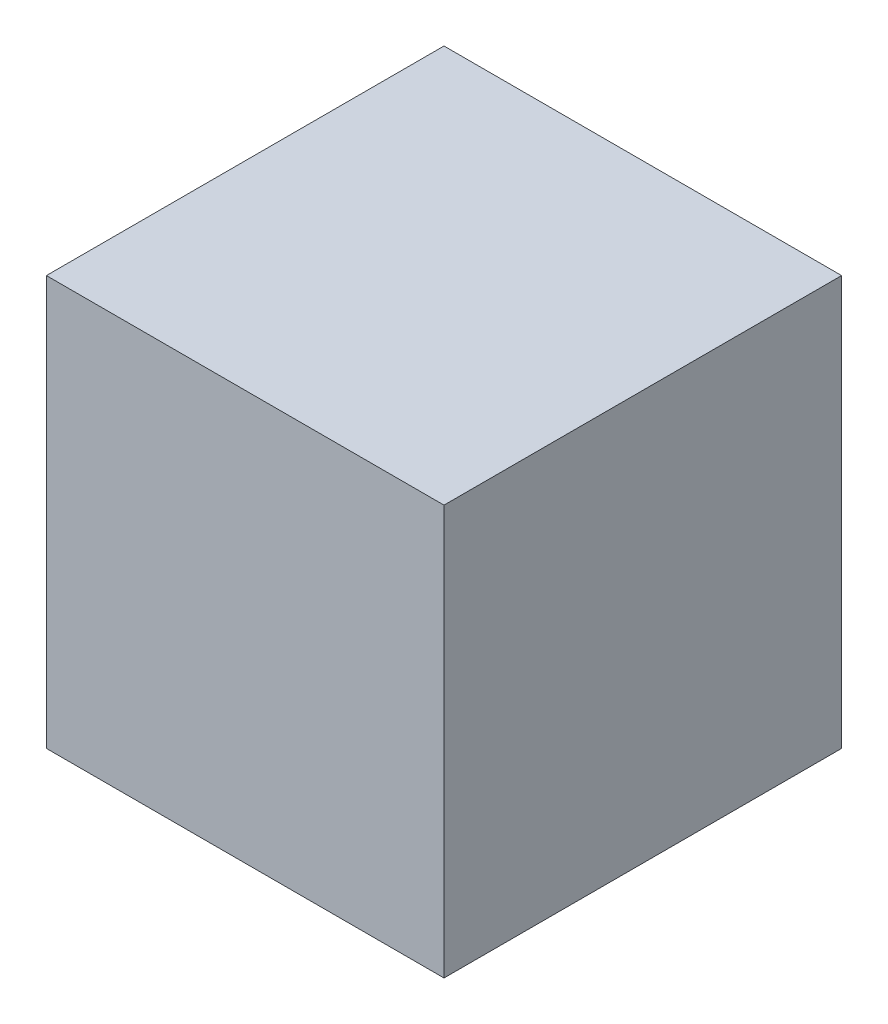
ISO-10303-21;
HEADER;
FILE_DESCRIPTION(('STEP AP214'),'2;1');
FILE_NAME('part.step','',(''),(''),'','','');
FILE_SCHEMA(('AUTOMOTIVE_DESIGN { 1 0 10303 214 1 1 1 1 }'));
ENDSEC;
DATA;
#1=APPLICATION_CONTEXT('core data for automotive mechanical design processes');
#2=APPLICATION_PROTOCOL_DEFINITION('international standard','automotive_design',2000,#1);
#3=PRODUCT_CONTEXT('',#1,'mechanical');
#4=PRODUCT('Part','Part','',(#3));
#5=PRODUCT_RELATED_PRODUCT_CATEGORY('part','',(#4));
#6=PRODUCT_DEFINITION_FORMATION('','',#4);
#7=PRODUCT_DEFINITION_CONTEXT('part definition',#1,'design');
#8=PRODUCT_DEFINITION('design','',#6,#7);
#9=PRODUCT_DEFINITION_SHAPE('','',#8);
#10=(LENGTH_UNIT() NAMED_UNIT(*) SI_UNIT(.MILLI.,.METRE.));
#11=(NAMED_UNIT(*) PLANE_ANGLE_UNIT() SI_UNIT($,.RADIAN.));
#12=(NAMED_UNIT(*) SI_UNIT($,.STERADIAN.) SOLID_ANGLE_UNIT());
#13=UNCERTAINTY_MEASURE_WITH_UNIT(LENGTH_MEASURE(1.E-05),#10,'distance_accuracy_value','');
#14=(GEOMETRIC_REPRESENTATION_CONTEXT(3) GLOBAL_UNCERTAINTY_ASSIGNED_CONTEXT((#13)) GLOBAL_UNIT_ASSIGNED_CONTEXT((#10,
#11,#12)) REPRESENTATION_CONTEXT('',''));
#15=CARTESIAN_POINT('',(0.,0.,0.));
#16=DIRECTION('',(0.,0.,1.));
#17=DIRECTION('',(1.,0.,0.));
#18=AXIS2_PLACEMENT_3D('',#15,#16,#17);
#19=CARTESIAN_POINT('',(50.,3.,-50.));
#20=DIRECTION('',(-1.,0.,0.));
#21=DIRECTION('',(0.,0.,1.));
#22=AXIS2_PLACEMENT_3D('',#19,#20,#21);
#23=PLANE('',#22);
#24=DIRECTION('',(0.,-1.,0.));
#25=VECTOR('',#24,1.);
#26=CARTESIAN_POINT('',(50.,3.,50.));
#27=LINE('',#26,#25);
#28=CARTESIAN_POINT('',(50.,3.,50.));
#29=VERTEX_POINT('',#28);
#30=CARTESIAN_POINT('',(50.,-100.,50.));
#31=VERTEX_POINT('',#30);
#32=EDGE_CURVE('E164',#29,#31,#27,.T.);
#33=ORIENTED_EDGE('',*,*,#32,.T.);
#34=DIRECTION('',(0.,0.,1.));
#35=VECTOR('',#34,1.);
#36=CARTESIAN_POINT('',(50.,-100.,-50.));
#37=LINE('',#36,#35);
#38=CARTESIAN_POINT('',(50.,-100.,-50.));
#39=VERTEX_POINT('',#38);
#40=EDGE_CURVE('E148',#39,#31,#37,.T.);
#41=ORIENTED_EDGE('',*,*,#40,.F.);
#42=DIRECTION('',(0.,-1.,0.));
#43=VECTOR('',#42,1.);
#44=CARTESIAN_POINT('',(50.,3.,-50.));
#45=LINE('',#44,#43);
#46=CARTESIAN_POINT('',(50.,3.,-50.));
#47=VERTEX_POINT('',#46);
#48=EDGE_CURVE('E11',#47,#39,#45,.T.);
#49=ORIENTED_EDGE('',*,*,#48,.F.);
#50=DIRECTION('',(0.,0.,-1.));
#51=VECTOR('',#50,1.);
#52=CARTESIAN_POINT('',(50.,3.,-50.));
#53=LINE('',#52,#51);
#54=EDGE_CURVE('E157',#29,#47,#53,.T.);
#55=ORIENTED_EDGE('',*,*,#54,.F.);
#56=EDGE_LOOP('',(#33,#41,#49,#55));
#57=FACE_BOUND('',#56,.T.);
#58=ADVANCED_FACE('F41',(#57),#23,.F.);
#59=CARTESIAN_POINT('',(-50.,3.,-50.));
#60=DIRECTION('',(0.,0.,1.));
#61=DIRECTION('',(1.,0.,0.));
#62=AXIS2_PLACEMENT_3D('',#59,#60,#61);
#63=PLANE('',#62);
#64=ORIENTED_EDGE('',*,*,#48,.T.);
#65=DIRECTION('',(1.,0.,0.));
#66=VECTOR('',#65,1.);
#67=CARTESIAN_POINT('',(-50.,-100.,-50.));
#68=LINE('',#67,#66);
#69=CARTESIAN_POINT('',(-50.,-100.,-50.));
#70=VERTEX_POINT('',#69);
#71=EDGE_CURVE('E122',#70,#39,#68,.T.);
#72=ORIENTED_EDGE('',*,*,#71,.F.);
#73=DIRECTION('',(0.,-1.,0.));
#74=VECTOR('',#73,1.);
#75=CARTESIAN_POINT('',(-50.,3.,-50.));
#76=LINE('',#75,#74);
#77=CARTESIAN_POINT('',(-50.,3.,-50.));
#78=VERTEX_POINT('',#77);
#79=EDGE_CURVE('E48',#78,#70,#76,.T.);
#80=ORIENTED_EDGE('',*,*,#79,.F.);
#81=DIRECTION('',(-1.,0.,0.));
#82=VECTOR('',#81,1.);
#83=CARTESIAN_POINT('',(-50.,3.,-50.));
#84=LINE('',#83,#82);
#85=EDGE_CURVE('E159',#47,#78,#84,.T.);
#86=ORIENTED_EDGE('',*,*,#85,.F.);
#87=EDGE_LOOP('',(#64,#72,#80,#86));
#88=FACE_BOUND('',#87,.T.);
#89=ADVANCED_FACE('F177',(#88),#63,.F.);
#90=CARTESIAN_POINT('',(-50.,3.,-50.));
#91=DIRECTION('',(1.,0.,0.));
#92=DIRECTION('',(0.,0.,-1.));
#93=AXIS2_PLACEMENT_3D('',#90,#91,#92);
#94=PLANE('',#93);
#95=ORIENTED_EDGE('',*,*,#79,.T.);
#96=DIRECTION('',(0.,0.,-1.));
#97=VECTOR('',#96,1.);
#98=CARTESIAN_POINT('',(-50.,-100.,50.));
#99=LINE('',#98,#97);
#100=CARTESIAN_POINT('',(-50.,-100.,50.));
#101=VERTEX_POINT('',#100);
#102=EDGE_CURVE('E154',#101,#70,#99,.T.);
#103=ORIENTED_EDGE('',*,*,#102,.F.);
#104=DIRECTION('',(0.,-1.,0.));
#105=VECTOR('',#104,1.);
#106=CARTESIAN_POINT('',(-50.,3.,50.));
#107=LINE('',#106,#105);
#108=CARTESIAN_POINT('',(-50.,3.,50.));
#109=VERTEX_POINT('',#108);
#110=EDGE_CURVE('E166',#109,#101,#107,.T.);
#111=ORIENTED_EDGE('',*,*,#110,.F.);
#112=DIRECTION('',(0.,0.,1.));
#113=VECTOR('',#112,1.);
#114=CARTESIAN_POINT('',(-50.,3.,-50.));
#115=LINE('',#114,#113);
#116=EDGE_CURVE('E161',#78,#109,#115,.T.);
#117=ORIENTED_EDGE('',*,*,#116,.F.);
#118=EDGE_LOOP('',(#95,#103,#111,#117));
#119=FACE_BOUND('',#118,.T.);
#120=ADVANCED_FACE('F171',(#119),#94,.F.);
#121=CARTESIAN_POINT('',(-50.,3.,50.));
#122=DIRECTION('',(0.,0.,-1.));
#123=DIRECTION('',(-1.,0.,0.));
#124=AXIS2_PLACEMENT_3D('',#121,#122,#123);
#125=PLANE('',#124);
#126=ORIENTED_EDGE('',*,*,#110,.T.);
#127=DIRECTION('',(-1.,0.,0.));
#128=VECTOR('',#127,1.);
#129=CARTESIAN_POINT('',(50.,-100.,50.));
#130=LINE('',#129,#128);
#131=EDGE_CURVE('E151',#31,#101,#130,.T.);
#132=ORIENTED_EDGE('',*,*,#131,.F.);
#133=ORIENTED_EDGE('',*,*,#32,.F.);
#134=DIRECTION('',(1.,0.,0.));
#135=VECTOR('',#134,1.);
#136=CARTESIAN_POINT('',(-50.,3.,50.));
#137=LINE('',#136,#135);
#138=EDGE_CURVE('E63',#109,#29,#137,.T.);
#139=ORIENTED_EDGE('',*,*,#138,.F.);
#140=EDGE_LOOP('',(#126,#132,#133,#139));
#141=FACE_BOUND('',#140,.T.);
#142=ADVANCED_FACE('F183',(#141),#125,.F.);
#143=CARTESIAN_POINT('',(0.,3.,0.));
#144=DIRECTION('',(0.,1.,0.));
#145=DIRECTION('',(0.,0.,1.));
#146=AXIS2_PLACEMENT_3D('',#143,#144,#145);
#147=PLANE('',#146);
#148=ORIENTED_EDGE('',*,*,#54,.T.);
#149=ORIENTED_EDGE('',*,*,#85,.T.);
#150=ORIENTED_EDGE('',*,*,#116,.T.);
#151=ORIENTED_EDGE('',*,*,#138,.T.);
#152=EDGE_LOOP('',(#148,#149,#150,#151));
#153=FACE_BOUND('',#152,.T.);
#154=ADVANCED_FACE('F184',(#153),#147,.T.);
#155=CARTESIAN_POINT('',(0.,-100.,0.));
#156=DIRECTION('',(0.,-1.,0.));
#157=DIRECTION('',(0.,0.,-1.));
#158=AXIS2_PLACEMENT_3D('',#155,#156,#157);
#159=PLANE('',#158);
#160=ORIENTED_EDGE('',*,*,#71,.T.);
#161=ORIENTED_EDGE('',*,*,#40,.T.);
#162=ORIENTED_EDGE('',*,*,#131,.T.);
#163=ORIENTED_EDGE('',*,*,#102,.T.);
#164=EDGE_LOOP('',(#160,#161,#162,#163));
#165=FACE_BOUND('',#164,.T.);
#166=DIRECTION('',(0.,0.,1.));
#167=VECTOR('',#166,1.);
#168=CARTESIAN_POINT('',(47.,-100.,-47.));
#169=LINE('',#168,#167);
#170=CARTESIAN_POINT('',(47.,-100.,-47.));
#171=VERTEX_POINT('',#170);
#172=CARTESIAN_POINT('',(47.,-100.,47.));
#173=VERTEX_POINT('',#172);
#174=EDGE_CURVE('E114',#171,#173,#169,.T.);
#175=ORIENTED_EDGE('',*,*,#174,.F.);
#176=DIRECTION('',(1.,0.,0.));
#177=VECTOR('',#176,1.);
#178=CARTESIAN_POINT('',(-47.,-100.,-47.));
#179=LINE('',#178,#177);
#180=CARTESIAN_POINT('',(-47.,-100.,-47.));
#181=VERTEX_POINT('',#180);
#182=EDGE_CURVE('E106',#181,#171,#179,.T.);
#183=ORIENTED_EDGE('',*,*,#182,.F.);
#184=DIRECTION('',(0.,0.,-1.));
#185=VECTOR('',#184,1.);
#186=CARTESIAN_POINT('',(-47.,-100.,47.));
#187=LINE('',#186,#185);
#188=CARTESIAN_POINT('',(-47.,-100.,47.));
#189=VERTEX_POINT('',#188);
#190=EDGE_CURVE('E130',#189,#181,#187,.T.);
#191=ORIENTED_EDGE('',*,*,#190,.F.);
#192=DIRECTION('',(-1.,0.,0.));
#193=VECTOR('',#192,1.);
#194=CARTESIAN_POINT('',(47.,-100.,47.));
#195=LINE('',#194,#193);
#196=EDGE_CURVE('E128',#173,#189,#195,.T.);
#197=ORIENTED_EDGE('',*,*,#196,.F.);
#198=EDGE_LOOP('',(#175,#183,#191,#197));
#199=FACE_BOUND('',#198,.T.);
#200=ADVANCED_FACE('F126',(#165,#199),#159,.T.);
#201=CARTESIAN_POINT('',(-47.,-100.,-47.));
#202=DIRECTION('',(0.,0.,1.));
#203=DIRECTION('',(1.,0.,0.));
#204=AXIS2_PLACEMENT_3D('',#201,#202,#203);
#205=PLANE('',#204);
#206=DIRECTION('',(1.,0.,0.));
#207=VECTOR('',#206,1.);
#208=CARTESIAN_POINT('',(-47.,0.,-47.));
#209=LINE('',#208,#207);
#210=CARTESIAN_POINT('',(-47.,0.,-47.));
#211=VERTEX_POINT('',#210);
#212=CARTESIAN_POINT('',(47.,0.,-47.));
#213=VERTEX_POINT('',#212);
#214=EDGE_CURVE('E134',#211,#213,#209,.T.);
#215=ORIENTED_EDGE('',*,*,#214,.F.);
#216=DIRECTION('',(0.,1.,0.));
#217=VECTOR('',#216,1.);
#218=CARTESIAN_POINT('',(-47.,-100.,-47.));
#219=LINE('',#218,#217);
#220=EDGE_CURVE('E55',#181,#211,#219,.T.);
#221=ORIENTED_EDGE('',*,*,#220,.F.);
#222=ORIENTED_EDGE('',*,*,#182,.T.);
#223=DIRECTION('',(0.,1.,0.));
#224=VECTOR('',#223,1.);
#225=CARTESIAN_POINT('',(47.,-100.,-47.));
#226=LINE('',#225,#224);
#227=EDGE_CURVE('E109',#171,#213,#226,.T.);
#228=ORIENTED_EDGE('',*,*,#227,.T.);
#229=EDGE_LOOP('',(#215,#221,#222,#228));
#230=FACE_BOUND('',#229,.T.);
#231=ADVANCED_FACE('F108',(#230),#205,.T.);
#232=CARTESIAN_POINT('',(47.,-100.,-47.));
#233=DIRECTION('',(-1.,0.,0.));
#234=DIRECTION('',(0.,0.,1.));
#235=AXIS2_PLACEMENT_3D('',#232,#233,#234);
#236=PLANE('',#235);
#237=DIRECTION('',(0.,0.,1.));
#238=VECTOR('',#237,1.);
#239=CARTESIAN_POINT('',(47.,0.,-47.));
#240=LINE('',#239,#238);
#241=CARTESIAN_POINT('',(47.,0.,47.));
#242=VERTEX_POINT('',#241);
#243=EDGE_CURVE('E121',#213,#242,#240,.T.);
#244=ORIENTED_EDGE('',*,*,#243,.F.);
#245=ORIENTED_EDGE('',*,*,#227,.F.);
#246=ORIENTED_EDGE('',*,*,#174,.T.);
#247=DIRECTION('',(0.,1.,0.));
#248=VECTOR('',#247,1.);
#249=CARTESIAN_POINT('',(47.,-100.,47.));
#250=LINE('',#249,#248);
#251=EDGE_CURVE('E123',#173,#242,#250,.T.);
#252=ORIENTED_EDGE('',*,*,#251,.T.);
#253=EDGE_LOOP('',(#244,#245,#246,#252));
#254=FACE_BOUND('',#253,.T.);
#255=ADVANCED_FACE('F118',(#254),#236,.T.);
#256=CARTESIAN_POINT('',(47.,-100.,47.));
#257=DIRECTION('',(0.,0.,-1.));
#258=DIRECTION('',(-1.,0.,0.));
#259=AXIS2_PLACEMENT_3D('',#256,#257,#258);
#260=PLANE('',#259);
#261=DIRECTION('',(-1.,0.,0.));
#262=VECTOR('',#261,1.);
#263=CARTESIAN_POINT('',(47.,0.,47.));
#264=LINE('',#263,#262);
#265=CARTESIAN_POINT('',(-47.,0.,47.));
#266=VERTEX_POINT('',#265);
#267=EDGE_CURVE('E137',#242,#266,#264,.T.);
#268=ORIENTED_EDGE('',*,*,#267,.F.);
#269=ORIENTED_EDGE('',*,*,#251,.F.);
#270=ORIENTED_EDGE('',*,*,#196,.T.);
#271=DIRECTION('',(0.,1.,0.));
#272=VECTOR('',#271,1.);
#273=CARTESIAN_POINT('',(-47.,-100.,47.));
#274=LINE('',#273,#272);
#275=EDGE_CURVE('E143',#189,#266,#274,.T.);
#276=ORIENTED_EDGE('',*,*,#275,.T.);
#277=EDGE_LOOP('',(#268,#269,#270,#276));
#278=FACE_BOUND('',#277,.T.);
#279=ADVANCED_FACE('F209',(#278),#260,.T.);
#280=CARTESIAN_POINT('',(-47.,-100.,47.));
#281=DIRECTION('',(1.,0.,0.));
#282=DIRECTION('',(0.,0.,-1.));
#283=AXIS2_PLACEMENT_3D('',#280,#281,#282);
#284=PLANE('',#283);
#285=DIRECTION('',(0.,0.,-1.));
#286=VECTOR('',#285,1.);
#287=CARTESIAN_POINT('',(-47.,0.,47.));
#288=LINE('',#287,#286);
#289=EDGE_CURVE('E115',#266,#211,#288,.T.);
#290=ORIENTED_EDGE('',*,*,#289,.F.);
#291=ORIENTED_EDGE('',*,*,#275,.F.);
#292=ORIENTED_EDGE('',*,*,#190,.T.);
#293=ORIENTED_EDGE('',*,*,#220,.T.);
#294=EDGE_LOOP('',(#290,#291,#292,#293));
#295=FACE_BOUND('',#294,.T.);
#296=ADVANCED_FACE('F204',(#295),#284,.T.);
#297=CARTESIAN_POINT('',(0.,0.,0.));
#298=DIRECTION('',(0.,1.,0.));
#299=DIRECTION('',(0.,0.,1.));
#300=AXIS2_PLACEMENT_3D('',#297,#298,#299);
#301=PLANE('',#300);
#302=ORIENTED_EDGE('',*,*,#289,.T.);
#303=ORIENTED_EDGE('',*,*,#214,.T.);
#304=ORIENTED_EDGE('',*,*,#243,.T.);
#305=ORIENTED_EDGE('',*,*,#267,.T.);
#306=EDGE_LOOP('',(#302,#303,#304,#305));
#307=FACE_BOUND('',#306,.T.);
#308=ADVANCED_FACE('F202',(#307),#301,.F.);
#309=CLOSED_SHELL('',(#58,#89,#120,#142,#154,#200,#231,#255,#279,#296,#308));
#310=MANIFOLD_SOLID_BREP('B2',#309);
#311=ADVANCED_BREP_SHAPE_REPRESENTATION('',(#18,#310),#14);
#312=SHAPE_DEFINITION_REPRESENTATION(#9,#311);
ENDSEC;
END-ISO-10303-21;
